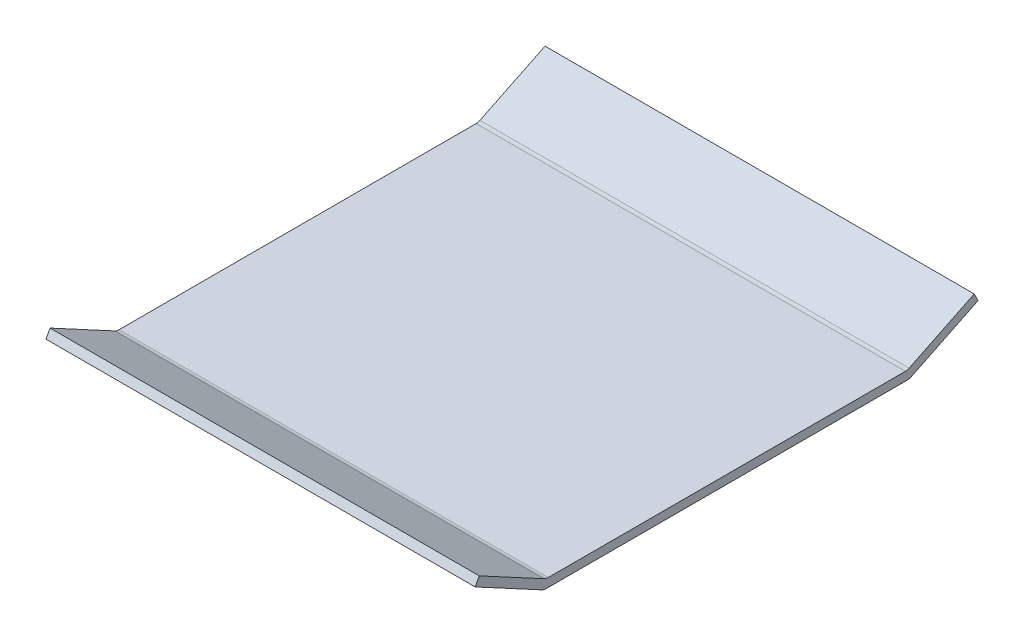
ISO-10303-21;
HEADER;
FILE_DESCRIPTION(('STEP AP214'),'2;1');
FILE_NAME('part.step','',(''),(''),'','','');
FILE_SCHEMA(('AUTOMOTIVE_DESIGN { 1 0 10303 214 1 1 1 1 }'));
ENDSEC;
DATA;
#1=APPLICATION_CONTEXT('core data for automotive mechanical design processes');
#2=APPLICATION_PROTOCOL_DEFINITION('international standard','automotive_design',2000,#1);
#3=PRODUCT_CONTEXT('',#1,'mechanical');
#4=PRODUCT('Part','Part','',(#3));
#5=PRODUCT_RELATED_PRODUCT_CATEGORY('part','',(#4));
#6=PRODUCT_DEFINITION_FORMATION('','',#4);
#7=PRODUCT_DEFINITION_CONTEXT('part definition',#1,'design');
#8=PRODUCT_DEFINITION('design','',#6,#7);
#9=PRODUCT_DEFINITION_SHAPE('','',#8);
#10=(LENGTH_UNIT() NAMED_UNIT(*) SI_UNIT(.MILLI.,.METRE.));
#11=(NAMED_UNIT(*) PLANE_ANGLE_UNIT() SI_UNIT($,.RADIAN.));
#12=(NAMED_UNIT(*) SI_UNIT($,.STERADIAN.) SOLID_ANGLE_UNIT());
#13=UNCERTAINTY_MEASURE_WITH_UNIT(LENGTH_MEASURE(1.E-05),#10,'distance_accuracy_value','');
#14=(GEOMETRIC_REPRESENTATION_CONTEXT(3) GLOBAL_UNCERTAINTY_ASSIGNED_CONTEXT((#13)) GLOBAL_UNIT_ASSIGNED_CONTEXT((#10,
#11,#12)) REPRESENTATION_CONTEXT('',''));
#15=CARTESIAN_POINT('',(0.,0.,0.));
#16=DIRECTION('',(0.,0.,1.));
#17=DIRECTION('',(1.,0.,0.));
#18=AXIS2_PLACEMENT_3D('',#15,#16,#17);
#19=CARTESIAN_POINT('',(-107.95,28.7069661262236,-221.782679465196));
#20=DIRECTION('',(0.,0.473716420580738,0.880677439742936));
#21=DIRECTION('',(0.,-0.880677439742936,0.473716420580738));
#22=AXIS2_PLACEMENT_3D('',#19,#20,#21);
#23=PLANE('',#22);
#24=DIRECTION('',(0.,-0.880677439742936,0.473716420580738));
#25=VECTOR('',#24,1.);
#26=CARTESIAN_POINT('',(50.8,28.7069661262236,-221.782679465196));
#27=LINE('',#26,#25);
#28=CARTESIAN_POINT('',(50.8,31.5031169974074,-223.28672910054));
#29=VERTEX_POINT('',#28);
#30=CARTESIAN_POINT('',(50.8,28.7069661262236,-221.782679465196));
#31=VERTEX_POINT('',#30);
#32=EDGE_CURVE('E154',#29,#31,#27,.T.);
#33=ORIENTED_EDGE('',*,*,#32,.F.);
#34=DIRECTION('',(1.,0.,0.));
#35=VECTOR('',#34,1.);
#36=CARTESIAN_POINT('',(-107.95,31.5031169974074,-223.28672910054));
#37=LINE('',#36,#35);
#38=CARTESIAN_POINT('',(-107.95,31.5031169974074,-223.28672910054));
#39=VERTEX_POINT('',#38);
#40=EDGE_CURVE('E11',#39,#29,#37,.T.);
#41=ORIENTED_EDGE('',*,*,#40,.F.);
#42=DIRECTION('',(0.,-0.880677439742936,0.473716420580738));
#43=VECTOR('',#42,1.);
#44=CARTESIAN_POINT('',(-107.95,28.7069661262236,-221.782679465196));
#45=LINE('',#44,#43);
#46=CARTESIAN_POINT('',(-107.95,28.7069661262236,-221.782679465196));
#47=VERTEX_POINT('',#46);
#48=EDGE_CURVE('E186',#39,#47,#45,.T.);
#49=ORIENTED_EDGE('',*,*,#48,.T.);
#50=DIRECTION('',(1.,0.,0.));
#51=VECTOR('',#50,1.);
#52=CARTESIAN_POINT('',(-107.95,28.7069661262236,-221.782679465196));
#53=LINE('',#52,#51);
#54=EDGE_CURVE('E36',#47,#31,#53,.T.);
#55=ORIENTED_EDGE('',*,*,#54,.T.);
#56=EDGE_LOOP('',(#33,#41,#49,#55));
#57=FACE_BOUND('',#56,.T.);
#58=ADVANCED_FACE('F33',(#57),#23,.T.);
#59=CARTESIAN_POINT('',(-107.95,31.5031169974074,-223.28672910054));
#60=DIRECTION('',(0.,0.880677439742937,-0.473716420580737));
#61=DIRECTION('',(0.,0.473716420580737,0.880677439742937));
#62=AXIS2_PLACEMENT_3D('',#59,#60,#61);
#63=PLANE('',#62);
#64=DIRECTION('',(0.,0.473716420580738,0.880677439742937));
#65=VECTOR('',#64,1.);
#66=CARTESIAN_POINT('',(50.8,31.5031169974074,-223.28672910054));
#67=LINE('',#66,#65);
#68=CARTESIAN_POINT('',(50.8,18.5981545125746,-247.278106277604));
#69=VERTEX_POINT('',#68);
#70=EDGE_CURVE('E184',#69,#29,#67,.T.);
#71=ORIENTED_EDGE('',*,*,#70,.F.);
#72=DIRECTION('',(1.,0.,0.));
#73=VECTOR('',#72,1.);
#74=CARTESIAN_POINT('',(-107.95,18.5981545125746,-247.278106277604));
#75=LINE('',#74,#73);
#76=CARTESIAN_POINT('',(-107.95,18.5981545125746,-247.278106277604));
#77=VERTEX_POINT('',#76);
#78=EDGE_CURVE('E42',#77,#69,#75,.T.);
#79=ORIENTED_EDGE('',*,*,#78,.F.);
#80=DIRECTION('',(0.,0.473716420580738,0.880677439742937));
#81=VECTOR('',#80,1.);
#82=CARTESIAN_POINT('',(-107.95,31.5031169974074,-223.28672910054));
#83=LINE('',#82,#81);
#84=EDGE_CURVE('E144',#77,#39,#83,.T.);
#85=ORIENTED_EDGE('',*,*,#84,.T.);
#86=ORIENTED_EDGE('',*,*,#40,.T.);
#87=EDGE_LOOP('',(#71,#79,#85,#86));
#88=FACE_BOUND('',#87,.T.);
#89=ADVANCED_FACE('F206',(#88),#63,.T.);
#90=CARTESIAN_POINT('',(-107.95,21.3943053837584,-248.782155912948));
#91=DIRECTION('',(1.,0.,0.));
#92=DIRECTION('',(0.,0.,-1.));
#93=AXIS2_PLACEMENT_3D('',#90,#91,#92);
#94=CYLINDRICAL_SURFACE('',#93,3.175);
#95=CARTESIAN_POINT('',(50.8,21.3943053837584,-248.782155912948));
#96=DIRECTION('',(-1.,0.,0.));
#97=DIRECTION('',(0.,0.,-1.));
#98=AXIS2_PLACEMENT_3D('',#95,#96,#97);
#99=CIRCLE('',#98,3.175);
#100=CARTESIAN_POINT('',(50.8,18.2193053837584,-248.782155912948));
#101=VERTEX_POINT('',#100);
#102=EDGE_CURVE('E131',#101,#69,#99,.T.);
#103=ORIENTED_EDGE('',*,*,#102,.F.);
#104=DIRECTION('',(1.,0.,0.));
#105=VECTOR('',#104,1.);
#106=CARTESIAN_POINT('',(-107.95,18.2193053837584,-248.782155912948));
#107=LINE('',#106,#105);
#108=CARTESIAN_POINT('',(-107.95,18.2193053837584,-248.782155912948));
#109=VERTEX_POINT('',#108);
#110=EDGE_CURVE('E126',#109,#101,#107,.T.);
#111=ORIENTED_EDGE('',*,*,#110,.F.);
#112=CARTESIAN_POINT('',(-107.95,21.3943053837584,-248.782155912948));
#113=DIRECTION('',(-1.,0.,0.));
#114=DIRECTION('',(0.,0.,-1.));
#115=AXIS2_PLACEMENT_3D('',#112,#113,#114);
#116=CIRCLE('',#115,3.175);
#117=EDGE_CURVE('E129',#109,#77,#116,.T.);
#118=ORIENTED_EDGE('',*,*,#117,.T.);
#119=ORIENTED_EDGE('',*,*,#78,.T.);
#120=EDGE_LOOP('',(#103,#111,#118,#119));
#121=FACE_BOUND('',#120,.T.);
#122=ADVANCED_FACE('F128',(#121),#94,.F.);
#123=CARTESIAN_POINT('',(-107.95,18.2193053837584,-248.782155912948));
#124=DIRECTION('',(0.,1.,0.));
#125=DIRECTION('',(0.,0.,1.));
#126=AXIS2_PLACEMENT_3D('',#123,#124,#125);
#127=PLANE('',#126);
#128=DIRECTION('',(0.,0.,1.));
#129=VECTOR('',#128,1.);
#130=CARTESIAN_POINT('',(50.8,18.2193053837584,-248.782155912948));
#131=LINE('',#130,#129);
#132=CARTESIAN_POINT('',(50.8,18.2193053837584,-380.892090882658));
#133=VERTEX_POINT('',#132);
#134=EDGE_CURVE('E181',#133,#101,#131,.T.);
#135=ORIENTED_EDGE('',*,*,#134,.F.);
#136=DIRECTION('',(1.,0.,0.));
#137=VECTOR('',#136,1.);
#138=CARTESIAN_POINT('',(-107.95,18.2193053837584,-380.892090882658));
#139=LINE('',#138,#137);
#140=CARTESIAN_POINT('',(-107.95,18.2193053837584,-380.892090882658));
#141=VERTEX_POINT('',#140);
#142=EDGE_CURVE('E136',#141,#133,#139,.T.);
#143=ORIENTED_EDGE('',*,*,#142,.F.);
#144=DIRECTION('',(0.,0.,1.));
#145=VECTOR('',#144,1.);
#146=CARTESIAN_POINT('',(-107.95,18.2193053837584,-248.782155912948));
#147=LINE('',#146,#145);
#148=EDGE_CURVE('E142',#141,#109,#147,.T.);
#149=ORIENTED_EDGE('',*,*,#148,.T.);
#150=ORIENTED_EDGE('',*,*,#110,.T.);
#151=EDGE_LOOP('',(#135,#143,#149,#150));
#152=FACE_BOUND('',#151,.T.);
#153=ADVANCED_FACE('F146',(#152),#127,.T.);
#154=CARTESIAN_POINT('',(-107.95,21.3943053837584,-380.892090882658));
#155=DIRECTION('',(1.,0.,0.));
#156=DIRECTION('',(0.,0.,-1.));
#157=AXIS2_PLACEMENT_3D('',#154,#155,#156);
#158=CYLINDRICAL_SURFACE('',#157,3.175);
#159=CARTESIAN_POINT('',(50.8,21.3943053837584,-380.892090882658));
#160=DIRECTION('',(-1.,0.,0.));
#161=DIRECTION('',(0.,0.,-1.));
#162=AXIS2_PLACEMENT_3D('',#159,#160,#161);
#163=CIRCLE('',#162,3.175);
#164=CARTESIAN_POINT('',(50.8,18.5403638041265,-382.283364565313));
#165=VERTEX_POINT('',#164);
#166=EDGE_CURVE('E178',#165,#133,#163,.T.);
#167=ORIENTED_EDGE('',*,*,#166,.F.);
#168=DIRECTION('',(1.,0.,0.));
#169=VECTOR('',#168,1.);
#170=CARTESIAN_POINT('',(-107.95,18.5403638041265,-382.283364565313));
#171=LINE('',#170,#169);
#172=CARTESIAN_POINT('',(-107.95,18.5403638041265,-382.283364565313));
#173=VERTEX_POINT('',#172);
#174=EDGE_CURVE('E190',#173,#165,#171,.T.);
#175=ORIENTED_EDGE('',*,*,#174,.F.);
#176=CARTESIAN_POINT('',(-107.95,21.3943053837584,-380.892090882658));
#177=DIRECTION('',(-1.,0.,0.));
#178=DIRECTION('',(0.,0.,-1.));
#179=AXIS2_PLACEMENT_3D('',#176,#177,#178);
#180=CIRCLE('',#179,3.175);
#181=EDGE_CURVE('E147',#173,#141,#180,.T.);
#182=ORIENTED_EDGE('',*,*,#181,.T.);
#183=ORIENTED_EDGE('',*,*,#142,.T.);
#184=EDGE_LOOP('',(#167,#175,#182,#183));
#185=FACE_BOUND('',#184,.T.);
#186=ADVANCED_FACE('F219',(#185),#158,.F.);
#187=CARTESIAN_POINT('',(-107.95,18.5403638041265,-382.283364565313));
#188=DIRECTION('',(0.,0.898879237679352,0.438196435481837));
#189=DIRECTION('',(0.,-0.438196435481837,0.898879237679352));
#190=AXIS2_PLACEMENT_3D('',#187,#188,#189);
#191=PLANE('',#190);
#192=DIRECTION('',(0.,-0.438196435481837,0.898879237679352));
#193=VECTOR('',#192,1.);
#194=CARTESIAN_POINT('',(50.8,18.5403638041265,-382.283364565313));
#195=LINE('',#194,#193);
#196=CARTESIAN_POINT('',(50.8,30.2805437110309,-406.366180194182));
#197=VERTEX_POINT('',#196);
#198=EDGE_CURVE('E175',#197,#165,#195,.T.);
#199=ORIENTED_EDGE('',*,*,#198,.F.);
#200=DIRECTION('',(1.,0.,0.));
#201=VECTOR('',#200,1.);
#202=CARTESIAN_POINT('',(-107.95,30.2805437110309,-406.366180194182));
#203=LINE('',#202,#201);
#204=CARTESIAN_POINT('',(-107.95,30.2805437110309,-406.366180194182));
#205=VERTEX_POINT('',#204);
#206=EDGE_CURVE('E192',#205,#197,#203,.T.);
#207=ORIENTED_EDGE('',*,*,#206,.F.);
#208=DIRECTION('',(0.,-0.438196435481837,0.898879237679352));
#209=VECTOR('',#208,1.);
#210=CARTESIAN_POINT('',(-107.95,18.5403638041265,-382.283364565313));
#211=LINE('',#210,#209);
#212=EDGE_CURVE('E149',#205,#173,#211,.T.);
#213=ORIENTED_EDGE('',*,*,#212,.T.);
#214=ORIENTED_EDGE('',*,*,#174,.T.);
#215=EDGE_LOOP('',(#199,#207,#213,#214));
#216=FACE_BOUND('',#215,.T.);
#217=ADVANCED_FACE('F222',(#216),#191,.T.);
#218=CARTESIAN_POINT('',(-107.95,30.2805437110309,-406.366180194182));
#219=DIRECTION('',(0.,0.438196435481842,-0.898879237679349));
#220=DIRECTION('',(0.,0.898879237679349,0.438196435481842));
#221=AXIS2_PLACEMENT_3D('',#218,#219,#220);
#222=PLANE('',#221);
#223=DIRECTION('',(0.,0.898879237679349,0.438196435481842));
#224=VECTOR('',#223,1.);
#225=CARTESIAN_POINT('',(50.8,30.2805437110309,-406.366180194182));
#226=LINE('',#225,#224);
#227=CARTESIAN_POINT('',(50.8,27.426602131399,-407.757453876837));
#228=VERTEX_POINT('',#227);
#229=EDGE_CURVE('E172',#228,#197,#226,.T.);
#230=ORIENTED_EDGE('',*,*,#229,.F.);
#231=DIRECTION('',(1.,0.,0.));
#232=VECTOR('',#231,1.);
#233=CARTESIAN_POINT('',(-107.95,27.426602131399,-407.757453876837));
#234=LINE('',#233,#232);
#235=CARTESIAN_POINT('',(-107.95,27.426602131399,-407.757453876837));
#236=VERTEX_POINT('',#235);
#237=EDGE_CURVE('E194',#236,#228,#234,.T.);
#238=ORIENTED_EDGE('',*,*,#237,.F.);
#239=DIRECTION('',(0.,0.898879237679349,0.438196435481842));
#240=VECTOR('',#239,1.);
#241=CARTESIAN_POINT('',(-107.95,30.2805437110309,-406.366180194182));
#242=LINE('',#241,#240);
#243=EDGE_CURVE('E348',#236,#205,#242,.T.);
#244=ORIENTED_EDGE('',*,*,#243,.T.);
#245=ORIENTED_EDGE('',*,*,#206,.T.);
#246=EDGE_LOOP('',(#230,#238,#244,#245));
#247=FACE_BOUND('',#246,.T.);
#248=ADVANCED_FACE('F226',(#247),#222,.T.);
#249=CARTESIAN_POINT('',(-107.95,15.3653638041265,-383.016046062403));
#250=DIRECTION('',(0.,-0.898879237679352,-0.438196435481837));
#251=DIRECTION('',(0.,0.438196435481837,-0.898879237679352));
#252=AXIS2_PLACEMENT_3D('',#249,#250,#251);
#253=PLANE('',#252);
#254=DIRECTION('',(0.,0.438196435481837,-0.898879237679352));
#255=VECTOR('',#254,1.);
#256=CARTESIAN_POINT('',(50.8,15.3653638041265,-383.016046062403));
#257=LINE('',#256,#255);
#258=CARTESIAN_POINT('',(50.8,15.3653638041265,-383.016046062403));
#259=VERTEX_POINT('',#258);
#260=EDGE_CURVE('E169',#259,#228,#257,.T.);
#261=ORIENTED_EDGE('',*,*,#260,.F.);
#262=DIRECTION('',(1.,0.,0.));
#263=VECTOR('',#262,1.);
#264=CARTESIAN_POINT('',(-107.95,15.3653638041265,-383.016046062403));
#265=LINE('',#264,#263);
#266=CARTESIAN_POINT('',(-107.95,15.3653638041265,-383.016046062403));
#267=VERTEX_POINT('',#266);
#268=EDGE_CURVE('E196',#267,#259,#265,.T.);
#269=ORIENTED_EDGE('',*,*,#268,.F.);
#270=DIRECTION('',(0.,0.438196435481837,-0.898879237679352));
#271=VECTOR('',#270,1.);
#272=CARTESIAN_POINT('',(-107.95,15.3653638041265,-383.016046062403));
#273=LINE('',#272,#271);
#274=EDGE_CURVE('E352',#267,#236,#273,.T.);
#275=ORIENTED_EDGE('',*,*,#274,.T.);
#276=ORIENTED_EDGE('',*,*,#237,.T.);
#277=EDGE_LOOP('',(#261,#269,#275,#276));
#278=FACE_BOUND('',#277,.T.);
#279=ADVANCED_FACE('F230',(#278),#253,.T.);
#280=CARTESIAN_POINT('',(-107.95,18.2193053837584,-381.624772379748));
#281=DIRECTION('',(1.,0.,0.));
#282=DIRECTION('',(0.,0.,-1.));
#283=AXIS2_PLACEMENT_3D('',#280,#281,#282);
#284=CYLINDRICAL_SURFACE('',#283,3.17499999999999);
#285=CARTESIAN_POINT('',(50.8,18.2193053837584,-381.624772379748));
#286=DIRECTION('',(1.,0.,0.));
#287=DIRECTION('',(0.,0.,-1.));
#288=AXIS2_PLACEMENT_3D('',#285,#286,#287);
#289=CIRCLE('',#288,3.17499999999999);
#290=CARTESIAN_POINT('',(50.8,15.0443053837584,-381.624772379748));
#291=VERTEX_POINT('',#290);
#292=EDGE_CURVE('E166',#291,#259,#289,.T.);
#293=ORIENTED_EDGE('',*,*,#292,.F.);
#294=DIRECTION('',(1.,0.,0.));
#295=VECTOR('',#294,1.);
#296=CARTESIAN_POINT('',(-107.95,15.0443053837584,-381.624772379748));
#297=LINE('',#296,#295);
#298=CARTESIAN_POINT('',(-107.95,15.0443053837584,-381.624772379748));
#299=VERTEX_POINT('',#298);
#300=EDGE_CURVE('E198',#299,#291,#297,.T.);
#301=ORIENTED_EDGE('',*,*,#300,.F.);
#302=CARTESIAN_POINT('',(-107.95,18.2193053837584,-381.624772379748));
#303=DIRECTION('',(1.,0.,0.));
#304=DIRECTION('',(0.,0.,-1.));
#305=AXIS2_PLACEMENT_3D('',#302,#303,#304);
#306=CIRCLE('',#305,3.17499999999999);
#307=EDGE_CURVE('E341',#299,#267,#306,.T.);
#308=ORIENTED_EDGE('',*,*,#307,.T.);
#309=ORIENTED_EDGE('',*,*,#268,.T.);
#310=EDGE_LOOP('',(#293,#301,#308,#309));
#311=FACE_BOUND('',#310,.T.);
#312=ADVANCED_FACE('F234',(#311),#284,.T.);
#313=CARTESIAN_POINT('',(-107.95,15.0443053837584,-247.982417689071));
#314=DIRECTION('',(0.,-1.,0.));
#315=DIRECTION('',(0.,0.,-1.));
#316=AXIS2_PLACEMENT_3D('',#313,#314,#315);
#317=PLANE('',#316);
#318=DIRECTION('',(0.,0.,-1.));
#319=VECTOR('',#318,1.);
#320=CARTESIAN_POINT('',(50.8,15.0443053837584,-247.982417689071));
#321=LINE('',#320,#319);
#322=CARTESIAN_POINT('',(50.8,15.0443053837584,-247.982417689071));
#323=VERTEX_POINT('',#322);
#324=EDGE_CURVE('E163',#323,#291,#321,.T.);
#325=ORIENTED_EDGE('',*,*,#324,.F.);
#326=DIRECTION('',(1.,0.,0.));
#327=VECTOR('',#326,1.);
#328=CARTESIAN_POINT('',(-107.95,15.0443053837584,-247.982417689071));
#329=LINE('',#328,#327);
#330=CARTESIAN_POINT('',(-107.95,15.0443053837584,-247.982417689071));
#331=VERTEX_POINT('',#330);
#332=EDGE_CURVE('E200',#331,#323,#329,.T.);
#333=ORIENTED_EDGE('',*,*,#332,.F.);
#334=DIRECTION('',(0.,0.,-1.));
#335=VECTOR('',#334,1.);
#336=CARTESIAN_POINT('',(-107.95,15.0443053837584,-247.982417689071));
#337=LINE('',#336,#335);
#338=EDGE_CURVE('E337',#331,#299,#337,.T.);
#339=ORIENTED_EDGE('',*,*,#338,.T.);
#340=ORIENTED_EDGE('',*,*,#300,.T.);
#341=EDGE_LOOP('',(#325,#333,#339,#340));
#342=FACE_BOUND('',#341,.T.);
#343=ADVANCED_FACE('F238',(#342),#317,.T.);
#344=CARTESIAN_POINT('',(-107.95,18.2193053837584,-247.982417689071));
#345=DIRECTION('',(1.,0.,0.));
#346=DIRECTION('',(0.,0.,-1.));
#347=AXIS2_PLACEMENT_3D('',#344,#345,#346);
#348=CYLINDRICAL_SURFACE('',#347,3.17499999999999);
#349=CARTESIAN_POINT('',(50.8,18.2193053837584,-247.982417689071));
#350=DIRECTION('',(1.,0.,0.));
#351=DIRECTION('',(0.,0.,-1.));
#352=AXIS2_PLACEMENT_3D('',#349,#350,#351);
#353=CIRCLE('',#352,3.17499999999999);
#354=CARTESIAN_POINT('',(50.8,15.4231545125746,-246.478368053728));
#355=VERTEX_POINT('',#354);
#356=EDGE_CURVE('E160',#355,#323,#353,.T.);
#357=ORIENTED_EDGE('',*,*,#356,.F.);
#358=DIRECTION('',(1.,0.,0.));
#359=VECTOR('',#358,1.);
#360=CARTESIAN_POINT('',(-107.95,15.4231545125746,-246.478368053728));
#361=LINE('',#360,#359);
#362=CARTESIAN_POINT('',(-107.95,15.4231545125746,-246.478368053728));
#363=VERTEX_POINT('',#362);
#364=EDGE_CURVE('E201',#363,#355,#361,.T.);
#365=ORIENTED_EDGE('',*,*,#364,.F.);
#366=CARTESIAN_POINT('',(-107.95,18.2193053837584,-247.982417689071));
#367=DIRECTION('',(1.,0.,0.));
#368=DIRECTION('',(0.,0.,-1.));
#369=AXIS2_PLACEMENT_3D('',#366,#367,#368);
#370=CIRCLE('',#369,3.17499999999999);
#371=EDGE_CURVE('E358',#363,#331,#370,.T.);
#372=ORIENTED_EDGE('',*,*,#371,.T.);
#373=ORIENTED_EDGE('',*,*,#332,.T.);
#374=EDGE_LOOP('',(#357,#365,#372,#373));
#375=FACE_BOUND('',#374,.T.);
#376=ADVANCED_FACE('F242',(#375),#348,.T.);
#377=CARTESIAN_POINT('',(-107.95,28.7069661262236,-221.782679465196));
#378=DIRECTION('',(0.,-0.880677439742937,0.473716420580737));
#379=DIRECTION('',(0.,-0.473716420580737,-0.880677439742937));
#380=AXIS2_PLACEMENT_3D('',#377,#378,#379);
#381=PLANE('',#380);
#382=DIRECTION('',(0.,-0.473716420580737,-0.880677439742937));
#383=VECTOR('',#382,1.);
#384=CARTESIAN_POINT('',(50.8,28.7069661262236,-221.782679465196));
#385=LINE('',#384,#383);
#386=EDGE_CURVE('E157',#31,#355,#385,.T.);
#387=ORIENTED_EDGE('',*,*,#386,.F.);
#388=ORIENTED_EDGE('',*,*,#54,.F.);
#389=DIRECTION('',(0.,-0.473716420580737,-0.880677439742937));
#390=VECTOR('',#389,1.);
#391=CARTESIAN_POINT('',(-107.95,28.7069661262236,-221.782679465196));
#392=LINE('',#391,#390);
#393=EDGE_CURVE('E360',#47,#363,#392,.T.);
#394=ORIENTED_EDGE('',*,*,#393,.T.);
#395=ORIENTED_EDGE('',*,*,#364,.T.);
#396=EDGE_LOOP('',(#387,#388,#394,#395));
#397=FACE_BOUND('',#396,.T.);
#398=ADVANCED_FACE('F203',(#397),#381,.T.);
#399=CARTESIAN_POINT('',(-107.95,21.3943053837584,-248.782155912948));
#400=DIRECTION('',(1.,0.,0.));
#401=DIRECTION('',(0.,0.,-1.));
#402=AXIS2_PLACEMENT_3D('',#399,#400,#401);
#403=PLANE('',#402);
#404=ORIENTED_EDGE('',*,*,#48,.F.);
#405=ORIENTED_EDGE('',*,*,#84,.F.);
#406=ORIENTED_EDGE('',*,*,#117,.F.);
#407=ORIENTED_EDGE('',*,*,#148,.F.);
#408=ORIENTED_EDGE('',*,*,#181,.F.);
#409=ORIENTED_EDGE('',*,*,#212,.F.);
#410=ORIENTED_EDGE('',*,*,#243,.F.);
#411=ORIENTED_EDGE('',*,*,#274,.F.);
#412=ORIENTED_EDGE('',*,*,#307,.F.);
#413=ORIENTED_EDGE('',*,*,#338,.F.);
#414=ORIENTED_EDGE('',*,*,#371,.F.);
#415=ORIENTED_EDGE('',*,*,#393,.F.);
#416=EDGE_LOOP('',(#404,#405,#406,#407,#408,#409,#410,#411,#412,#413,#414,#415));
#417=FACE_BOUND('',#416,.T.);
#418=ADVANCED_FACE('F140',(#417),#403,.F.);
#419=CARTESIAN_POINT('',(50.8,21.3943053837584,-248.782155912948));
#420=DIRECTION('',(1.,0.,0.));
#421=DIRECTION('',(0.,0.,-1.));
#422=AXIS2_PLACEMENT_3D('',#419,#420,#421);
#423=PLANE('',#422);
#424=ORIENTED_EDGE('',*,*,#32,.T.);
#425=ORIENTED_EDGE('',*,*,#386,.T.);
#426=ORIENTED_EDGE('',*,*,#356,.T.);
#427=ORIENTED_EDGE('',*,*,#324,.T.);
#428=ORIENTED_EDGE('',*,*,#292,.T.);
#429=ORIENTED_EDGE('',*,*,#260,.T.);
#430=ORIENTED_EDGE('',*,*,#229,.T.);
#431=ORIENTED_EDGE('',*,*,#198,.T.);
#432=ORIENTED_EDGE('',*,*,#166,.T.);
#433=ORIENTED_EDGE('',*,*,#134,.T.);
#434=ORIENTED_EDGE('',*,*,#102,.T.);
#435=ORIENTED_EDGE('',*,*,#70,.T.);
#436=EDGE_LOOP('',(#424,#425,#426,#427,#428,#429,#430,#431,#432,#433,#434,#435));
#437=FACE_BOUND('',#436,.T.);
#438=ADVANCED_FACE('F205',(#437),#423,.T.);
#439=CLOSED_SHELL('',(#58,#89,#122,#153,#186,#217,#248,#279,#312,#343,#376,#398,#418,#438));
#440=MANIFOLD_SOLID_BREP('B2',#439);
#441=ADVANCED_BREP_SHAPE_REPRESENTATION('',(#18,#440),#14);
#442=SHAPE_DEFINITION_REPRESENTATION(#9,#441);
ENDSEC;
END-ISO-10303-21;
